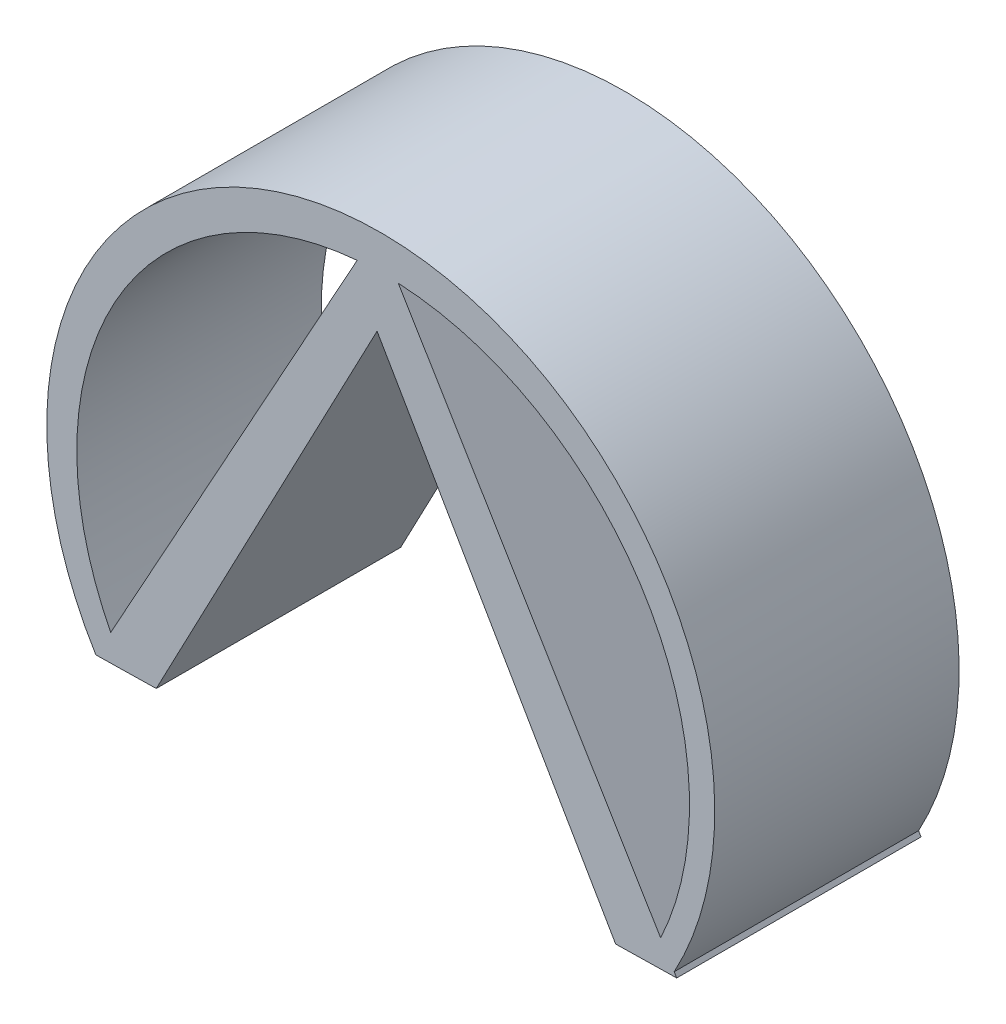
ISO-10303-21;
HEADER;
FILE_DESCRIPTION(('STEP AP214'),'2;1');
FILE_NAME('part.step','',(''),(''),'','','');
FILE_SCHEMA(('AUTOMOTIVE_DESIGN { 1 0 10303 214 1 1 1 1 }'));
ENDSEC;
DATA;
#1=APPLICATION_CONTEXT('core data for automotive mechanical design processes');
#2=APPLICATION_PROTOCOL_DEFINITION('international standard','automotive_design',2000,#1);
#3=PRODUCT_CONTEXT('',#1,'mechanical');
#4=PRODUCT('Part','Part','',(#3));
#5=PRODUCT_RELATED_PRODUCT_CATEGORY('part','',(#4));
#6=PRODUCT_DEFINITION_FORMATION('','',#4);
#7=PRODUCT_DEFINITION_CONTEXT('part definition',#1,'design');
#8=PRODUCT_DEFINITION('design','',#6,#7);
#9=PRODUCT_DEFINITION_SHAPE('','',#8);
#10=(LENGTH_UNIT() NAMED_UNIT(*) SI_UNIT(.MILLI.,.METRE.));
#11=(NAMED_UNIT(*) PLANE_ANGLE_UNIT() SI_UNIT($,.RADIAN.));
#12=(NAMED_UNIT(*) SI_UNIT($,.STERADIAN.) SOLID_ANGLE_UNIT());
#13=UNCERTAINTY_MEASURE_WITH_UNIT(LENGTH_MEASURE(1.E-05),#10,'distance_accuracy_value','');
#14=(GEOMETRIC_REPRESENTATION_CONTEXT(3) GLOBAL_UNCERTAINTY_ASSIGNED_CONTEXT((#13)) GLOBAL_UNIT_ASSIGNED_CONTEXT((#10,
#11,#12)) REPRESENTATION_CONTEXT('',''));
#15=CARTESIAN_POINT('',(0.,0.,0.));
#16=DIRECTION('',(0.,0.,1.));
#17=DIRECTION('',(1.,0.,0.));
#18=AXIS2_PLACEMENT_3D('',#15,#16,#17);
#19=CARTESIAN_POINT('',(29.396751628679,17.6960780014865,50.));
#20=DIRECTION('',(-0.856745926991678,-0.515738709603196,0.));
#21=DIRECTION('',(0.515738709603196,-0.856745926991678,0.));
#22=AXIS2_PLACEMENT_3D('',#19,#20,#21);
#23=PLANE('',#22);
#24=DIRECTION('',(-0.515738709603197,0.856745926991678,0.));
#25=VECTOR('',#24,1.);
#26=CARTESIAN_POINT('',(29.396751628679,17.6960780014865,0.));
#27=LINE('',#26,#25);
#28=CARTESIAN_POINT('',(56.759373510532,-27.7587509895882,0.));
#29=VERTEX_POINT('',#28);
#30=CARTESIAN_POINT('',(3.08608206075541,61.4034022123949,0.));
#31=VERTEX_POINT('',#30);
#32=EDGE_CURVE('E164',#29,#31,#27,.T.);
#33=ORIENTED_EDGE('',*,*,#32,.T.);
#34=DIRECTION('',(0.,0.,-1.));
#35=VECTOR('',#34,1.);
#36=CARTESIAN_POINT('',(3.08608206075541,61.4034022123949,50.));
#37=LINE('',#36,#35);
#38=CARTESIAN_POINT('',(3.08608206075541,61.4034022123949,50.));
#39=VERTEX_POINT('',#38);
#40=EDGE_CURVE('E11',#39,#31,#37,.T.);
#41=ORIENTED_EDGE('',*,*,#40,.F.);
#42=DIRECTION('',(-0.515738709603197,0.856745926991678,0.));
#43=VECTOR('',#42,1.);
#44=CARTESIAN_POINT('',(29.396751628679,17.6960780014865,50.));
#45=LINE('',#44,#43);
#46=CARTESIAN_POINT('',(56.759373510532,-27.7587509895882,50.));
#47=VERTEX_POINT('',#46);
#48=EDGE_CURVE('E126',#47,#39,#45,.T.);
#49=ORIENTED_EDGE('',*,*,#48,.F.);
#50=DIRECTION('',(0.,0.,-1.));
#51=VECTOR('',#50,1.);
#52=CARTESIAN_POINT('',(56.759373510532,-27.7587509895882,50.));
#53=LINE('',#52,#51);
#54=EDGE_CURVE('E45',#47,#29,#53,.T.);
#55=ORIENTED_EDGE('',*,*,#54,.T.);
#56=EDGE_LOOP('',(#33,#41,#49,#55));
#57=FACE_BOUND('',#56,.T.);
#58=ADVANCED_FACE('F35',(#57),#23,.F.);
#59=CARTESIAN_POINT('',(-30.0236289109778,16.6102946984344,50.));
#60=DIRECTION('',(0.875015787727213,-0.484094382562043,0.));
#61=DIRECTION('',(0.484094382562043,0.875015787727213,0.));
#62=AXIS2_PLACEMENT_3D('',#59,#60,#61);
#63=PLANE('',#62);
#64=DIRECTION('',(-0.484094382562043,-0.875015787727213,0.));
#65=VECTOR('',#64,1.);
#66=CARTESIAN_POINT('',(-30.0236289109778,16.6102946984344,0.));
#67=LINE('',#66,#65);
#68=CARTESIAN_POINT('',(-5.32471834583079,61.2543506153531,0.));
#69=VERTEX_POINT('',#68);
#70=CARTESIAN_POINT('',(-55.7420287980188,-29.8765201601505,0.));
#71=VERTEX_POINT('',#70);
#72=EDGE_CURVE('E161',#69,#71,#67,.T.);
#73=ORIENTED_EDGE('',*,*,#72,.T.);
#74=DIRECTION('',(0.,0.,-1.));
#75=VECTOR('',#74,1.);
#76=CARTESIAN_POINT('',(-55.7420287980188,-29.8765201601505,50.));
#77=LINE('',#76,#75);
#78=CARTESIAN_POINT('',(-55.7420287980188,-29.8765201601505,50.));
#79=VERTEX_POINT('',#78);
#80=EDGE_CURVE('E135',#79,#71,#77,.T.);
#81=ORIENTED_EDGE('',*,*,#80,.F.);
#82=DIRECTION('',(-0.484094382562043,-0.875015787727213,0.));
#83=VECTOR('',#82,1.);
#84=CARTESIAN_POINT('',(-30.0236289109778,16.6102946984344,50.));
#85=LINE('',#84,#83);
#86=CARTESIAN_POINT('',(-5.32471834583079,61.2543506153531,50.));
#87=VERTEX_POINT('',#86);
#88=EDGE_CURVE('E122',#87,#79,#85,.T.);
#89=ORIENTED_EDGE('',*,*,#88,.F.);
#90=DIRECTION('',(0.,0.,-1.));
#91=VECTOR('',#90,1.);
#92=CARTESIAN_POINT('',(-5.32471834583079,61.2543506153531,50.));
#93=LINE('',#92,#91);
#94=EDGE_CURVE('E129',#87,#69,#93,.T.);
#95=ORIENTED_EDGE('',*,*,#94,.T.);
#96=EDGE_LOOP('',(#73,#81,#89,#95));
#97=FACE_BOUND('',#96,.T.);
#98=ADVANCED_FACE('F137',(#97),#63,.F.);
#99=CARTESIAN_POINT('',(-0.50152984311829,0.260300020210359,50.));
#100=DIRECTION('',(0.,0.,-1.));
#101=DIRECTION('',(-1.,0.,0.));
#102=AXIS2_PLACEMENT_3D('',#99,#100,#101);
#103=CYLINDRICAL_SURFACE('',#102,68.3304601551275);
#104=CARTESIAN_POINT('',(-0.50152984311829,0.260300020210359,0.));
#105=DIRECTION('',(0.,0.,1.));
#106=DIRECTION('',(1.,0.,0.));
#107=AXIS2_PLACEMENT_3D('',#104,#105,#106);
#108=CIRCLE('',#107,68.3304601551275);
#109=CARTESIAN_POINT('',(-58.7935032573581,-35.392156002973,0.));
#110=VERTEX_POINT('',#109);
#111=CARTESIAN_POINT('',(59.5348021821719,-32.369297310443,0.));
#112=VERTEX_POINT('',#111);
#113=EDGE_CURVE('E147',#110,#112,#108,.F.);
#114=ORIENTED_EDGE('',*,*,#113,.F.);
#115=DIRECTION('',(0.,0.,-1.));
#116=VECTOR('',#115,1.);
#117=CARTESIAN_POINT('',(-58.7935032573581,-35.392156002973,50.));
#118=LINE('',#117,#116);
#119=CARTESIAN_POINT('',(-58.7935032573581,-35.392156002973,50.));
#120=VERTEX_POINT('',#119);
#121=EDGE_CURVE('E39',#120,#110,#118,.T.);
#122=ORIENTED_EDGE('',*,*,#121,.F.);
#123=CARTESIAN_POINT('',(-0.50152984311829,0.260300020210359,50.));
#124=DIRECTION('',(0.,0.,1.));
#125=DIRECTION('',(1.,0.,0.));
#126=AXIS2_PLACEMENT_3D('',#123,#124,#125);
#127=CIRCLE('',#126,68.3304601551275);
#128=CARTESIAN_POINT('',(59.5348021821719,-32.369297310443,50.));
#129=VERTEX_POINT('',#128);
#130=EDGE_CURVE('E168',#120,#129,#127,.F.);
#131=ORIENTED_EDGE('',*,*,#130,.T.);
#132=DIRECTION('',(0.,0.,-1.));
#133=VECTOR('',#132,1.);
#134=CARTESIAN_POINT('',(59.5348021821719,-32.369297310443,50.));
#135=LINE('',#134,#133);
#136=EDGE_CURVE('E146',#129,#112,#135,.T.);
#137=ORIENTED_EDGE('',*,*,#136,.T.);
#138=EDGE_LOOP('',(#114,#122,#131,#137));
#139=FACE_BOUND('',#138,.T.);
#140=ADVANCED_FACE('F37',(#139),#103,.T.);
#141=CARTESIAN_POINT('',(0.626877282298715,-34.3063726999209,50.));
#142=DIRECTION('',(-0.0182698607355336,0.99983309216524,0.));
#143=DIRECTION('',(-0.999833092165239,-0.0182698607355336,0.));
#144=AXIS2_PLACEMENT_3D('',#141,#142,#143);
#145=PLANE('',#144);
#146=DIRECTION('',(0.99983309216524,0.0182698607355336,0.));
#147=VECTOR('',#146,1.);
#148=CARTESIAN_POINT('',(0.626877282298715,-34.3063726999209,0.));
#149=LINE('',#148,#147);
#150=CARTESIAN_POINT('',(-46.4305117885899,-35.1662481647759,0.));
#151=VERTEX_POINT('',#150);
#152=EDGE_CURVE('E150',#110,#151,#149,.T.);
#153=ORIENTED_EDGE('',*,*,#152,.T.);
#154=DIRECTION('',(0.,0.,-1.));
#155=VECTOR('',#154,1.);
#156=CARTESIAN_POINT('',(-46.4305117885899,-35.1662481647759,50.));
#157=LINE('',#156,#155);
#158=CARTESIAN_POINT('',(-46.4305117885899,-35.1662481647759,50.));
#159=VERTEX_POINT('',#158);
#160=EDGE_CURVE('E180',#159,#151,#157,.T.);
#161=ORIENTED_EDGE('',*,*,#160,.F.);
#162=DIRECTION('',(0.99983309216524,0.0182698607355336,0.));
#163=VECTOR('',#162,1.);
#164=CARTESIAN_POINT('',(0.626877282298715,-34.3063726999209,50.));
#165=LINE('',#164,#163);
#166=EDGE_CURVE('E189',#120,#159,#165,.T.);
#167=ORIENTED_EDGE('',*,*,#166,.F.);
#168=ORIENTED_EDGE('',*,*,#121,.T.);
#169=EDGE_LOOP('',(#153,#161,#167,#168));
#170=FACE_BOUND('',#169,.T.);
#171=ADVANCED_FACE('F188',(#170),#145,.F.);
#172=CARTESIAN_POINT('',(-21.8832233809173,11.5088000223796,50.));
#173=DIRECTION('',(-0.885062968017171,0.46547131237557,0.));
#174=DIRECTION('',(-0.46547131237557,-0.885062968017172,0.));
#175=AXIS2_PLACEMENT_3D('',#172,#173,#174);
#176=PLANE('',#175);
#177=DIRECTION('',(0.46547131237557,0.885062968017171,0.));
#178=VECTOR('',#177,1.);
#179=CARTESIAN_POINT('',(-21.8832233809173,11.5088000223796,0.));
#180=LINE('',#179,#178);
#181=CARTESIAN_POINT('',(-1.2537545645975,50.7343729282728,0.));
#182=VERTEX_POINT('',#181);
#183=EDGE_CURVE('E152',#151,#182,#180,.T.);
#184=ORIENTED_EDGE('',*,*,#183,.T.);
#185=DIRECTION('',(0.,0.,-1.));
#186=VECTOR('',#185,1.);
#187=CARTESIAN_POINT('',(-1.2537545645975,50.7343729282728,50.));
#188=LINE('',#187,#186);
#189=CARTESIAN_POINT('',(-1.2537545645975,50.7343729282728,50.));
#190=VERTEX_POINT('',#189);
#191=EDGE_CURVE('E178',#190,#182,#188,.T.);
#192=ORIENTED_EDGE('',*,*,#191,.F.);
#193=DIRECTION('',(0.46547131237557,0.885062968017171,0.));
#194=VECTOR('',#193,1.);
#195=CARTESIAN_POINT('',(-21.8832233809173,11.5088000223796,50.));
#196=LINE('',#195,#194);
#197=EDGE_CURVE('E212',#159,#190,#196,.T.);
#198=ORIENTED_EDGE('',*,*,#197,.F.);
#199=ORIENTED_EDGE('',*,*,#160,.T.);
#200=EDGE_LOOP('',(#184,#192,#198,#199));
#201=FACE_BOUND('',#200,.T.);
#202=ADVANCED_FACE('F211',(#201),#176,.F.);
#203=CARTESIAN_POINT('',(21.0757874599207,12.2187467346419,50.));
#204=DIRECTION('',(0.865123990521396,0.501558053493646,0.));
#205=DIRECTION('',(-0.501558053493646,0.865123990521396,0.));
#206=AXIS2_PLACEMENT_3D('',#203,#204,#205);
#207=PLANE('',#206);
#208=DIRECTION('',(0.501558053493646,-0.865123990521396,0.));
#209=VECTOR('',#208,1.);
#210=CARTESIAN_POINT('',(21.0757874599207,12.2187467346419,0.));
#211=LINE('',#210,#209);
#212=CARTESIAN_POINT('',(47.5517442978727,-33.4489187987388,0.));
#213=VERTEX_POINT('',#212);
#214=EDGE_CURVE('E154',#182,#213,#211,.T.);
#215=ORIENTED_EDGE('',*,*,#214,.T.);
#216=DIRECTION('',(0.,0.,-1.));
#217=VECTOR('',#216,1.);
#218=CARTESIAN_POINT('',(47.5517442978727,-33.4489187987388,50.));
#219=LINE('',#218,#217);
#220=CARTESIAN_POINT('',(47.5517442978727,-33.4489187987388,50.));
#221=VERTEX_POINT('',#220);
#222=EDGE_CURVE('E175',#221,#213,#219,.T.);
#223=ORIENTED_EDGE('',*,*,#222,.F.);
#224=DIRECTION('',(0.501558053493646,-0.865123990521396,0.));
#225=VECTOR('',#224,1.);
#226=CARTESIAN_POINT('',(21.0757874599207,12.2187467346419,50.));
#227=LINE('',#226,#225);
#228=EDGE_CURVE('E209',#190,#221,#227,.T.);
#229=ORIENTED_EDGE('',*,*,#228,.F.);
#230=ORIENTED_EDGE('',*,*,#191,.T.);
#231=EDGE_LOOP('',(#215,#223,#229,#230));
#232=FACE_BOUND('',#231,.T.);
#233=ADVANCED_FACE('F208',(#232),#207,.F.);
#234=CARTESIAN_POINT('',(0.626877282298739,-34.3063726999208,50.));
#235=DIRECTION('',(-0.0182698607355343,0.99983309216524,0.));
#236=DIRECTION('',(-0.999833092165239,-0.0182698607355343,0.));
#237=AXIS2_PLACEMENT_3D('',#234,#235,#236);
#238=PLANE('',#237);
#239=DIRECTION('',(0.99983309216524,0.0182698607355343,0.));
#240=VECTOR('',#239,1.);
#241=CARTESIAN_POINT('',(0.626877282298739,-34.3063726999208,0.));
#242=LINE('',#241,#240);
#243=CARTESIAN_POINT('',(60.0472578219556,-33.2205893968687,0.));
#244=VERTEX_POINT('',#243);
#245=EDGE_CURVE('E156',#213,#244,#242,.T.);
#246=ORIENTED_EDGE('',*,*,#245,.T.);
#247=DIRECTION('',(0.,0.,-1.));
#248=VECTOR('',#247,1.);
#249=CARTESIAN_POINT('',(60.0472578219556,-33.2205893968687,50.));
#250=LINE('',#249,#248);
#251=CARTESIAN_POINT('',(60.0472578219556,-33.2205893968687,50.));
#252=VERTEX_POINT('',#251);
#253=EDGE_CURVE('E172',#252,#244,#250,.T.);
#254=ORIENTED_EDGE('',*,*,#253,.F.);
#255=DIRECTION('',(0.99983309216524,0.0182698607355343,0.));
#256=VECTOR('',#255,1.);
#257=CARTESIAN_POINT('',(0.626877282298739,-34.3063726999208,50.));
#258=LINE('',#257,#256);
#259=EDGE_CURVE('E140',#221,#252,#258,.T.);
#260=ORIENTED_EDGE('',*,*,#259,.F.);
#261=ORIENTED_EDGE('',*,*,#222,.T.);
#262=EDGE_LOOP('',(#246,#254,#260,#261));
#263=FACE_BOUND('',#262,.T.);
#264=ADVANCED_FACE('F203',(#263),#238,.F.);
#265=CARTESIAN_POINT('',(-0.0112660118740363,-1.19715816788962,50.));
#266=DIRECTION('',(0.,0.,-1.));
#267=DIRECTION('',(-1.,0.,0.));
#268=AXIS2_PLACEMENT_3D('',#265,#266,#267);
#269=CYLINDRICAL_SURFACE('',#268,62.6771387749048);
#270=CARTESIAN_POINT('',(-0.0112660118740363,-1.19715816788962,0.));
#271=DIRECTION('',(0.,0.,1.));
#272=DIRECTION('',(1.,0.,0.));
#273=AXIS2_PLACEMENT_3D('',#270,#271,#272);
#274=CIRCLE('',#273,62.6771387749048);
#275=EDGE_CURVE('E131',#71,#69,#274,.F.);
#276=ORIENTED_EDGE('',*,*,#275,.T.);
#277=ORIENTED_EDGE('',*,*,#94,.F.);
#278=CARTESIAN_POINT('',(-0.0112660118740363,-1.19715816788962,50.));
#279=DIRECTION('',(0.,0.,1.));
#280=DIRECTION('',(1.,0.,0.));
#281=AXIS2_PLACEMENT_3D('',#278,#279,#280);
#282=CIRCLE('',#281,62.6771387749048);
#283=EDGE_CURVE('E118',#79,#87,#282,.F.);
#284=ORIENTED_EDGE('',*,*,#283,.F.);
#285=ORIENTED_EDGE('',*,*,#80,.T.);
#286=EDGE_LOOP('',(#276,#277,#284,#285));
#287=FACE_BOUND('',#286,.T.);
#288=ADVANCED_FACE('F130',(#287),#269,.F.);
#289=CARTESIAN_POINT('',(29.396751628679,17.6960780014865,50.));
#290=DIRECTION('',(-0.856745926991678,-0.515738709603197,0.));
#291=DIRECTION('',(0.515738709603197,-0.856745926991678,0.));
#292=AXIS2_PLACEMENT_3D('',#289,#290,#291);
#293=PLANE('',#292);
#294=DIRECTION('',(-0.515738709603197,0.856745926991678,0.));
#295=VECTOR('',#294,1.);
#296=CARTESIAN_POINT('',(29.396751628679,17.6960780014865,0.));
#297=LINE('',#296,#295);
#298=EDGE_CURVE('E158',#244,#112,#297,.T.);
#299=ORIENTED_EDGE('',*,*,#298,.T.);
#300=ORIENTED_EDGE('',*,*,#136,.F.);
#301=DIRECTION('',(-0.515738709603197,0.856745926991678,0.));
#302=VECTOR('',#301,1.);
#303=CARTESIAN_POINT('',(29.396751628679,17.6960780014865,50.));
#304=LINE('',#303,#302);
#305=EDGE_CURVE('E138',#252,#129,#304,.T.);
#306=ORIENTED_EDGE('',*,*,#305,.F.);
#307=ORIENTED_EDGE('',*,*,#253,.T.);
#308=EDGE_LOOP('',(#299,#300,#306,#307));
#309=FACE_BOUND('',#308,.T.);
#310=ADVANCED_FACE('F199',(#309),#293,.F.);
#311=CARTESIAN_POINT('',(-0.0112660118740363,-1.19715816788962,50.));
#312=DIRECTION('',(0.,0.,-1.));
#313=DIRECTION('',(-1.,0.,0.));
#314=AXIS2_PLACEMENT_3D('',#311,#312,#313);
#315=CYLINDRICAL_SURFACE('',#314,62.6771387749048);
#316=CARTESIAN_POINT('',(-0.0112660118740363,-1.19715816788962,0.));
#317=DIRECTION('',(0.,0.,1.));
#318=DIRECTION('',(1.,0.,0.));
#319=AXIS2_PLACEMENT_3D('',#316,#317,#318);
#320=CIRCLE('',#319,62.6771387749048);
#321=EDGE_CURVE('E87',#31,#29,#320,.F.);
#322=ORIENTED_EDGE('',*,*,#321,.T.);
#323=ORIENTED_EDGE('',*,*,#54,.F.);
#324=CARTESIAN_POINT('',(-0.0112660118740363,-1.19715816788962,50.));
#325=DIRECTION('',(0.,0.,1.));
#326=DIRECTION('',(1.,0.,0.));
#327=AXIS2_PLACEMENT_3D('',#324,#325,#326);
#328=CIRCLE('',#327,62.6771387749048);
#329=EDGE_CURVE('E53',#39,#47,#328,.F.);
#330=ORIENTED_EDGE('',*,*,#329,.F.);
#331=ORIENTED_EDGE('',*,*,#40,.T.);
#332=EDGE_LOOP('',(#322,#323,#330,#331));
#333=FACE_BOUND('',#332,.T.);
#334=ADVANCED_FACE('F219',(#333),#315,.F.);
#335=CARTESIAN_POINT('',(0.,0.,50.));
#336=DIRECTION('',(0.,0.,1.));
#337=DIRECTION('',(1.,0.,0.));
#338=AXIS2_PLACEMENT_3D('',#335,#336,#337);
#339=PLANE('',#338);
#340=ORIENTED_EDGE('',*,*,#130,.F.);
#341=ORIENTED_EDGE('',*,*,#166,.T.);
#342=ORIENTED_EDGE('',*,*,#197,.T.);
#343=ORIENTED_EDGE('',*,*,#228,.T.);
#344=ORIENTED_EDGE('',*,*,#259,.T.);
#345=ORIENTED_EDGE('',*,*,#305,.T.);
#346=EDGE_LOOP('',(#340,#341,#342,#343,#344,#345));
#347=FACE_BOUND('',#346,.T.);
#348=ORIENTED_EDGE('',*,*,#88,.T.);
#349=ORIENTED_EDGE('',*,*,#283,.T.);
#350=EDGE_LOOP('',(#348,#349));
#351=FACE_BOUND('',#350,.T.);
#352=ORIENTED_EDGE('',*,*,#48,.T.);
#353=ORIENTED_EDGE('',*,*,#329,.T.);
#354=EDGE_LOOP('',(#352,#353));
#355=FACE_BOUND('',#354,.T.);
#356=ADVANCED_FACE('F120',(#347,#351,#355),#339,.T.);
#357=CARTESIAN_POINT('',(0.,0.,0.));
#358=DIRECTION('',(0.,0.,1.));
#359=DIRECTION('',(1.,0.,0.));
#360=AXIS2_PLACEMENT_3D('',#357,#358,#359);
#361=PLANE('',#360);
#362=ORIENTED_EDGE('',*,*,#113,.T.);
#363=ORIENTED_EDGE('',*,*,#298,.F.);
#364=ORIENTED_EDGE('',*,*,#245,.F.);
#365=ORIENTED_EDGE('',*,*,#214,.F.);
#366=ORIENTED_EDGE('',*,*,#183,.F.);
#367=ORIENTED_EDGE('',*,*,#152,.F.);
#368=EDGE_LOOP('',(#362,#363,#364,#365,#366,#367));
#369=FACE_BOUND('',#368,.T.);
#370=ORIENTED_EDGE('',*,*,#72,.F.);
#371=ORIENTED_EDGE('',*,*,#275,.F.);
#372=EDGE_LOOP('',(#370,#371));
#373=FACE_BOUND('',#372,.T.);
#374=ORIENTED_EDGE('',*,*,#32,.F.);
#375=ORIENTED_EDGE('',*,*,#321,.F.);
#376=EDGE_LOOP('',(#374,#375));
#377=FACE_BOUND('',#376,.T.);
#378=ADVANCED_FACE('F192',(#369,#373,#377),#361,.F.);
#379=CLOSED_SHELL('',(#58,#98,#140,#171,#202,#233,#264,#288,#310,#334,#356,#378));
#380=MANIFOLD_SOLID_BREP('B2',#379);
#381=ADVANCED_BREP_SHAPE_REPRESENTATION('',(#18,#380),#14);
#382=SHAPE_DEFINITION_REPRESENTATION(#9,#381);
ENDSEC;
END-ISO-10303-21;
